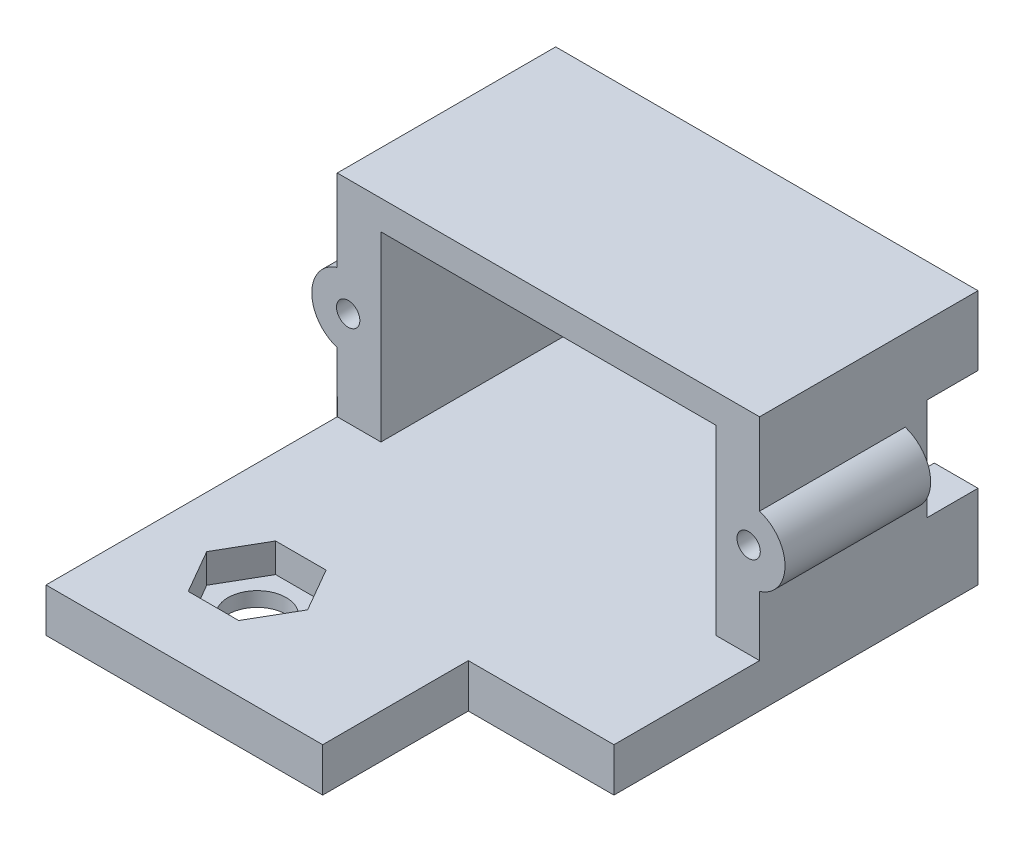
ISO-10303-21;
HEADER;
FILE_DESCRIPTION(('STEP AP214'),'2;1');
FILE_NAME('part.step','',(''),(''),'','','');
FILE_SCHEMA(('AUTOMOTIVE_DESIGN { 1 0 10303 214 1 1 1 1 }'));
ENDSEC;
DATA;
#1=APPLICATION_CONTEXT('core data for automotive mechanical design processes');
#2=APPLICATION_PROTOCOL_DEFINITION('international standard','automotive_design',2000,#1);
#3=PRODUCT_CONTEXT('',#1,'mechanical');
#4=PRODUCT('Part','Part','',(#3));
#5=PRODUCT_RELATED_PRODUCT_CATEGORY('part','',(#4));
#6=PRODUCT_DEFINITION_FORMATION('','',#4);
#7=PRODUCT_DEFINITION_CONTEXT('part definition',#1,'design');
#8=PRODUCT_DEFINITION('design','',#6,#7);
#9=PRODUCT_DEFINITION_SHAPE('','',#8);
#10=(LENGTH_UNIT() NAMED_UNIT(*) SI_UNIT(.MILLI.,.METRE.));
#11=(NAMED_UNIT(*) PLANE_ANGLE_UNIT() SI_UNIT($,.RADIAN.));
#12=(NAMED_UNIT(*) SI_UNIT($,.STERADIAN.) SOLID_ANGLE_UNIT());
#13=UNCERTAINTY_MEASURE_WITH_UNIT(LENGTH_MEASURE(1.E-05),#10,'distance_accuracy_value','');
#14=(GEOMETRIC_REPRESENTATION_CONTEXT(3) GLOBAL_UNCERTAINTY_ASSIGNED_CONTEXT((#13)) GLOBAL_UNIT_ASSIGNED_CONTEXT((#10,
#11,#12)) REPRESENTATION_CONTEXT('',''));
#15=CARTESIAN_POINT('',(0.,0.,0.));
#16=DIRECTION('',(0.,0.,1.));
#17=DIRECTION('',(1.,0.,0.));
#18=AXIS2_PLACEMENT_3D('',#15,#16,#17);
#19=CARTESIAN_POINT('',(0.,3.,0.));
#20=DIRECTION('',(0.,-1.,0.));
#21=DIRECTION('',(0.,0.,-1.));
#22=AXIS2_PLACEMENT_3D('',#19,#20,#21);
#23=PLANE('',#22);
#24=DIRECTION('',(1.,0.,0.));
#25=VECTOR('',#24,1.);
#26=CARTESIAN_POINT('',(-14.5,3.,27.5));
#27=LINE('',#26,#25);
#28=CARTESIAN_POINT('',(-14.5,3.,27.5));
#29=VERTEX_POINT('',#28);
#30=CARTESIAN_POINT('',(4.5,3.,27.5));
#31=VERTEX_POINT('',#30);
#32=EDGE_CURVE('E347',#29,#31,#27,.T.);
#33=ORIENTED_EDGE('',*,*,#32,.T.);
#34=DIRECTION('',(0.,0.,1.));
#35=VECTOR('',#34,1.);
#36=CARTESIAN_POINT('',(4.5,3.,17.5));
#37=LINE('',#36,#35);
#38=CARTESIAN_POINT('',(4.5,3.,17.5));
#39=VERTEX_POINT('',#38);
#40=EDGE_CURVE('E331',#39,#31,#37,.T.);
#41=ORIENTED_EDGE('',*,*,#40,.F.);
#42=DIRECTION('',(-1.,0.,0.));
#43=VECTOR('',#42,1.);
#44=CARTESIAN_POINT('',(14.5,3.,17.5));
#45=LINE('',#44,#43);
#46=CARTESIAN_POINT('',(14.5,3.,17.5));
#47=VERTEX_POINT('',#46);
#48=EDGE_CURVE('E317',#47,#39,#45,.T.);
#49=ORIENTED_EDGE('',*,*,#48,.F.);
#50=DIRECTION('',(0.,0.,-1.));
#51=VECTOR('',#50,1.);
#52=CARTESIAN_POINT('',(14.5,3.,7.5));
#53=LINE('',#52,#51);
#54=CARTESIAN_POINT('',(14.5,3.,7.5));
#55=VERTEX_POINT('',#54);
#56=EDGE_CURVE('E345',#47,#55,#53,.T.);
#57=ORIENTED_EDGE('',*,*,#56,.T.);
#58=DIRECTION('',(-1.,0.,0.));
#59=VECTOR('',#58,1.);
#60=CARTESIAN_POINT('',(-14.5,3.,7.5));
#61=LINE('',#60,#59);
#62=CARTESIAN_POINT('',(11.5,3.,7.5));
#63=VERTEX_POINT('',#62);
#64=EDGE_CURVE('E51',#55,#63,#61,.T.);
#65=ORIENTED_EDGE('',*,*,#64,.T.);
#66=DIRECTION('',(0.,0.,-1.));
#67=VECTOR('',#66,1.);
#68=CARTESIAN_POINT('',(11.5,3.,7.5));
#69=LINE('',#68,#67);
#70=CARTESIAN_POINT('',(11.5,3.,-7.5));
#71=VERTEX_POINT('',#70);
#72=EDGE_CURVE('E435',#63,#71,#69,.T.);
#73=ORIENTED_EDGE('',*,*,#72,.T.);
#74=DIRECTION('',(-1.,0.,0.));
#75=VECTOR('',#74,1.);
#76=CARTESIAN_POINT('',(-11.5,3.,-7.5));
#77=LINE('',#76,#75);
#78=CARTESIAN_POINT('',(-11.5,3.,-7.5));
#79=VERTEX_POINT('',#78);
#80=EDGE_CURVE('E438',#71,#79,#77,.T.);
#81=ORIENTED_EDGE('',*,*,#80,.T.);
#82=DIRECTION('',(0.,0.,1.));
#83=VECTOR('',#82,1.);
#84=CARTESIAN_POINT('',(-11.5,3.,7.5));
#85=LINE('',#84,#83);
#86=CARTESIAN_POINT('',(-11.5,3.,7.5));
#87=VERTEX_POINT('',#86);
#88=EDGE_CURVE('E441',#79,#87,#85,.T.);
#89=ORIENTED_EDGE('',*,*,#88,.T.);
#90=CARTESIAN_POINT('',(-14.5,3.,7.5));
#91=VERTEX_POINT('',#90);
#92=EDGE_CURVE('E11',#87,#91,#61,.T.);
#93=ORIENTED_EDGE('',*,*,#92,.T.);
#94=DIRECTION('',(0.,0.,1.));
#95=VECTOR('',#94,1.);
#96=CARTESIAN_POINT('',(-14.5,3.,7.5));
#97=LINE('',#96,#95);
#98=EDGE_CURVE('E351',#91,#29,#97,.T.);
#99=ORIENTED_EDGE('',*,*,#98,.T.);
#100=EDGE_LOOP('',(#33,#41,#49,#57,#65,#73,#81,#89,#93,#99));
#101=FACE_BOUND('',#100,.T.);
#102=DIRECTION('',(0.5,0.,0.866025403784439));
#103=VECTOR('',#102,1.);
#104=CARTESIAN_POINT('',(-11.6871778264911,3.,6.74759526419164));
#105=LINE('',#104,#103);
#106=CARTESIAN_POINT('',(-5.76794919243112,3.,17.));
#107=VERTEX_POINT('',#106);
#108=CARTESIAN_POINT('',(-4.03589838486224,3.,20.));
#109=VERTEX_POINT('',#108);
#110=EDGE_CURVE('E66',#107,#109,#105,.T.);
#111=ORIENTED_EDGE('',*,*,#110,.T.);
#112=DIRECTION('',(-0.5,0.,0.866025403784439));
#113=VECTOR('',#112,1.);
#114=CARTESIAN_POINT('',(5.63333024919771,3.,3.25240473580836));
#115=LINE('',#114,#113);
#116=CARTESIAN_POINT('',(-5.76794919243112,3.,23.));
#117=VERTEX_POINT('',#116);
#118=EDGE_CURVE('E289',#109,#117,#115,.T.);
#119=ORIENTED_EDGE('',*,*,#118,.T.);
#120=DIRECTION('',(-1.,0.,0.));
#121=VECTOR('',#120,1.);
#122=CARTESIAN_POINT('',(0.,3.,23.));
#123=LINE('',#122,#121);
#124=CARTESIAN_POINT('',(-9.23205080756888,3.,23.));
#125=VERTEX_POINT('',#124);
#126=EDGE_CURVE('E310',#117,#125,#123,.T.);
#127=ORIENTED_EDGE('',*,*,#126,.T.);
#128=DIRECTION('',(-0.5,0.,-0.866025403784439));
#129=VECTOR('',#128,1.);
#130=CARTESIAN_POINT('',(-16.8833302491977,3.,9.74759526419163));
#131=LINE('',#130,#129);
#132=CARTESIAN_POINT('',(-10.9641016151378,3.,20.));
#133=VERTEX_POINT('',#132);
#134=EDGE_CURVE('E307',#125,#133,#131,.T.);
#135=ORIENTED_EDGE('',*,*,#134,.T.);
#136=DIRECTION('',(0.5,0.,-0.866025403784439));
#137=VECTOR('',#136,1.);
#138=CARTESIAN_POINT('',(0.437177826491066,3.,0.252404735808352));
#139=LINE('',#138,#137);
#140=CARTESIAN_POINT('',(-9.23205080756887,3.,17.));
#141=VERTEX_POINT('',#140);
#142=EDGE_CURVE('E304',#133,#141,#139,.T.);
#143=ORIENTED_EDGE('',*,*,#142,.T.);
#144=DIRECTION('',(1.,0.,0.));
#145=VECTOR('',#144,1.);
#146=CARTESIAN_POINT('',(0.,3.,17.));
#147=LINE('',#146,#145);
#148=EDGE_CURVE('E301',#141,#107,#147,.T.);
#149=ORIENTED_EDGE('',*,*,#148,.T.);
#150=EDGE_LOOP('',(#111,#119,#127,#135,#143,#149));
#151=FACE_BOUND('',#150,.T.);
#152=ADVANCED_FACE('F35',(#101,#151),#23,.F.);
#153=CARTESIAN_POINT('',(-11.5,3.,7.5));
#154=DIRECTION('',(0.,0.,-1.));
#155=DIRECTION('',(-1.,0.,0.));
#156=AXIS2_PLACEMENT_3D('',#153,#154,#155);
#157=PLANE('',#156);
#158=CARTESIAN_POINT('',(-13.75,9.5,7.5));
#159=DIRECTION('',(0.,0.,1.));
#160=DIRECTION('',(1.,0.,0.));
#161=AXIS2_PLACEMENT_3D('',#158,#159,#160);
#162=CIRCLE('',#161,0.799999999999999);
#163=CARTESIAN_POINT('',(-12.95,9.5,7.5));
#164=VERTEX_POINT('',#163);
#165=EDGE_CURVE('E357',#164,#164,#162,.T.);
#166=ORIENTED_EDGE('',*,*,#165,.F.);
#167=EDGE_LOOP('',(#166));
#168=FACE_BOUND('',#167,.T.);
#169=ORIENTED_EDGE('',*,*,#92,.F.);
#170=DIRECTION('',(0.,1.,0.));
#171=VECTOR('',#170,1.);
#172=CARTESIAN_POINT('',(-11.5,0.,7.5));
#173=LINE('',#172,#171);
#174=CARTESIAN_POINT('',(-11.5,15.5,7.5));
#175=VERTEX_POINT('',#174);
#176=EDGE_CURVE('E412',#87,#175,#173,.T.);
#177=ORIENTED_EDGE('',*,*,#176,.T.);
#178=DIRECTION('',(1.,0.,0.));
#179=VECTOR('',#178,1.);
#180=CARTESIAN_POINT('',(-14.5,15.5,7.5));
#181=LINE('',#180,#179);
#182=CARTESIAN_POINT('',(11.5,15.5,7.5));
#183=VERTEX_POINT('',#182);
#184=EDGE_CURVE('E274',#175,#183,#181,.T.);
#185=ORIENTED_EDGE('',*,*,#184,.T.);
#186=DIRECTION('',(0.,1.,0.));
#187=VECTOR('',#186,1.);
#188=CARTESIAN_POINT('',(11.5,0.,7.5));
#189=LINE('',#188,#187);
#190=EDGE_CURVE('E422',#63,#183,#189,.T.);
#191=ORIENTED_EDGE('',*,*,#190,.F.);
#192=ORIENTED_EDGE('',*,*,#64,.F.);
#193=DIRECTION('',(0.,1.,0.));
#194=VECTOR('',#193,1.);
#195=CARTESIAN_POINT('',(14.5,0.,7.5));
#196=LINE('',#195,#194);
#197=CARTESIAN_POINT('',(14.5,7.11515199645764,7.5));
#198=VERTEX_POINT('',#197);
#199=EDGE_CURVE('E431',#55,#198,#196,.T.);
#200=ORIENTED_EDGE('',*,*,#199,.T.);
#201=CARTESIAN_POINT('',(13.75,9.5,7.5));
#202=DIRECTION('',(0.,0.,1.));
#203=DIRECTION('',(1.,0.,0.));
#204=AXIS2_PLACEMENT_3D('',#201,#202,#203);
#205=CIRCLE('',#204,2.5);
#206=CARTESIAN_POINT('',(14.5,11.8848480035424,7.5));
#207=VERTEX_POINT('',#206);
#208=EDGE_CURVE('E385',#198,#207,#205,.T.);
#209=ORIENTED_EDGE('',*,*,#208,.T.);
#210=CARTESIAN_POINT('',(14.5,17.5,7.5));
#211=VERTEX_POINT('',#210);
#212=EDGE_CURVE('E433',#207,#211,#196,.T.);
#213=ORIENTED_EDGE('',*,*,#212,.T.);
#214=DIRECTION('',(1.,0.,0.));
#215=VECTOR('',#214,1.);
#216=CARTESIAN_POINT('',(-14.5,17.5,7.5));
#217=LINE('',#216,#215);
#218=CARTESIAN_POINT('',(-14.5,17.5,7.5));
#219=VERTEX_POINT('',#218);
#220=EDGE_CURVE('E263',#219,#211,#217,.T.);
#221=ORIENTED_EDGE('',*,*,#220,.F.);
#222=DIRECTION('',(0.,1.,0.));
#223=VECTOR('',#222,1.);
#224=CARTESIAN_POINT('',(-14.5,0.,7.5));
#225=LINE('',#224,#223);
#226=CARTESIAN_POINT('',(-14.5,11.8848480035424,7.5));
#227=VERTEX_POINT('',#226);
#228=EDGE_CURVE('E416',#227,#219,#225,.T.);
#229=ORIENTED_EDGE('',*,*,#228,.F.);
#230=CARTESIAN_POINT('',(-13.75,9.5,7.5));
#231=DIRECTION('',(0.,0.,1.));
#232=DIRECTION('',(1.,0.,0.));
#233=AXIS2_PLACEMENT_3D('',#230,#231,#232);
#234=CIRCLE('',#233,2.5);
#235=CARTESIAN_POINT('',(-14.5,7.11515199645763,7.5));
#236=VERTEX_POINT('',#235);
#237=EDGE_CURVE('E370',#236,#227,#234,.F.);
#238=ORIENTED_EDGE('',*,*,#237,.F.);
#239=EDGE_CURVE('E414',#91,#236,#225,.T.);
#240=ORIENTED_EDGE('',*,*,#239,.F.);
#241=EDGE_LOOP('',(#169,#177,#185,#191,#192,#200,#209,#213,#221,#229,#238,#240));
#242=FACE_BOUND('',#241,.T.);
#243=CARTESIAN_POINT('',(13.75,9.5,7.5));
#244=DIRECTION('',(0.,0.,1.));
#245=DIRECTION('',(1.,0.,0.));
#246=AXIS2_PLACEMENT_3D('',#243,#244,#245);
#247=CIRCLE('',#246,0.799999999999999);
#248=CARTESIAN_POINT('',(14.55,9.5,7.5));
#249=VERTEX_POINT('',#248);
#250=EDGE_CURVE('E361',#249,#249,#247,.T.);
#251=ORIENTED_EDGE('',*,*,#250,.F.);
#252=EDGE_LOOP('',(#251));
#253=FACE_BOUND('',#252,.T.);
#254=ADVANCED_FACE('F469',(#168,#242,#253),#157,.F.);
#255=CARTESIAN_POINT('',(0.,0.,-2.5));
#256=DIRECTION('',(0.,0.,1.));
#257=DIRECTION('',(1.,0.,0.));
#258=AXIS2_PLACEMENT_3D('',#255,#256,#257);
#259=PLANE('',#258);
#260=CARTESIAN_POINT('',(-13.75,9.5,-2.5));
#261=DIRECTION('',(0.,0.,1.));
#262=DIRECTION('',(1.,0.,0.));
#263=AXIS2_PLACEMENT_3D('',#260,#261,#262);
#264=CIRCLE('',#263,0.799999999999998);
#265=CARTESIAN_POINT('',(-14.5,9.2216117818585,-2.5));
#266=VERTEX_POINT('',#265);
#267=CARTESIAN_POINT('',(-14.5,9.77838821814149,-2.5));
#268=VERTEX_POINT('',#267);
#269=EDGE_CURVE('E358',#266,#268,#264,.F.);
#270=ORIENTED_EDGE('',*,*,#269,.F.);
#271=DIRECTION('',(0.,-1.,0.));
#272=VECTOR('',#271,1.);
#273=CARTESIAN_POINT('',(-14.5,0.,-2.5));
#274=LINE('',#273,#272);
#275=CARTESIAN_POINT('',(-14.5,7.11515199645763,-2.5));
#276=VERTEX_POINT('',#275);
#277=EDGE_CURVE('E374',#266,#276,#274,.T.);
#278=ORIENTED_EDGE('',*,*,#277,.T.);
#279=CARTESIAN_POINT('',(-13.75,9.5,-2.5));
#280=DIRECTION('',(0.,0.,1.));
#281=DIRECTION('',(1.,0.,0.));
#282=AXIS2_PLACEMENT_3D('',#279,#280,#281);
#283=CIRCLE('',#282,2.5);
#284=CARTESIAN_POINT('',(-14.5,11.8848480035424,-2.5));
#285=VERTEX_POINT('',#284);
#286=EDGE_CURVE('E371',#276,#285,#283,.F.);
#287=ORIENTED_EDGE('',*,*,#286,.T.);
#288=EDGE_CURVE('E375',#285,#268,#274,.T.);
#289=ORIENTED_EDGE('',*,*,#288,.T.);
#290=EDGE_LOOP('',(#270,#278,#287,#289));
#291=FACE_BOUND('',#290,.T.);
#292=ADVANCED_FACE('F530',(#291),#259,.F.);
#293=CARTESIAN_POINT('',(-14.5,0.,-7.5));
#294=DIRECTION('',(-1.,0.,0.));
#295=DIRECTION('',(0.,0.,1.));
#296=AXIS2_PLACEMENT_3D('',#293,#294,#295);
#297=PLANE('',#296);
#298=DIRECTION('',(0.,0.,1.));
#299=VECTOR('',#298,1.);
#300=CARTESIAN_POINT('',(-14.5,0.,-7.5));
#301=LINE('',#300,#299);
#302=CARTESIAN_POINT('',(-14.5,0.,-7.5));
#303=VERTEX_POINT('',#302);
#304=CARTESIAN_POINT('',(-14.5,0.,27.5));
#305=VERTEX_POINT('',#304);
#306=EDGE_CURVE('E405',#303,#305,#301,.T.);
#307=ORIENTED_EDGE('',*,*,#306,.T.);
#308=DIRECTION('',(0.,-1.,0.));
#309=VECTOR('',#308,1.);
#310=CARTESIAN_POINT('',(-14.5,38.2278299076171,27.5));
#311=LINE('',#310,#309);
#312=EDGE_CURVE('E348',#29,#305,#311,.T.);
#313=ORIENTED_EDGE('',*,*,#312,.F.);
#314=ORIENTED_EDGE('',*,*,#98,.F.);
#315=ORIENTED_EDGE('',*,*,#239,.T.);
#316=DIRECTION('',(0.,0.,1.));
#317=VECTOR('',#316,1.);
#318=CARTESIAN_POINT('',(-14.5,7.11515199645763,-2.5));
#319=LINE('',#318,#317);
#320=EDGE_CURVE('E378',#276,#236,#319,.T.);
#321=ORIENTED_EDGE('',*,*,#320,.F.);
#322=ORIENTED_EDGE('',*,*,#277,.F.);
#323=EDGE_CURVE('E379',#268,#266,#274,.T.);
#324=ORIENTED_EDGE('',*,*,#323,.F.);
#325=ORIENTED_EDGE('',*,*,#288,.F.);
#326=DIRECTION('',(0.,0.,1.));
#327=VECTOR('',#326,1.);
#328=CARTESIAN_POINT('',(-14.5,11.8848480035424,-2.5));
#329=LINE('',#328,#327);
#330=EDGE_CURVE('E382',#285,#227,#329,.T.);
#331=ORIENTED_EDGE('',*,*,#330,.T.);
#332=ORIENTED_EDGE('',*,*,#228,.T.);
#333=DIRECTION('',(0.,0.,1.));
#334=VECTOR('',#333,1.);
#335=CARTESIAN_POINT('',(-14.5,17.5,-7.5));
#336=LINE('',#335,#334);
#337=CARTESIAN_POINT('',(-14.5,17.5,-7.5));
#338=VERTEX_POINT('',#337);
#339=EDGE_CURVE('E260',#338,#219,#336,.T.);
#340=ORIENTED_EDGE('',*,*,#339,.F.);
#341=DIRECTION('',(0.,1.,0.));
#342=VECTOR('',#341,1.);
#343=CARTESIAN_POINT('',(-14.5,0.,-7.5));
#344=LINE('',#343,#342);
#345=EDGE_CURVE('E408',#303,#338,#344,.T.);
#346=ORIENTED_EDGE('',*,*,#345,.F.);
#347=EDGE_LOOP('',(#307,#313,#314,#315,#321,#322,#324,#325,#331,#332,#340,#346));
#348=FACE_BOUND('',#347,.T.);
#349=ADVANCED_FACE('F454',(#348),#297,.T.);
#350=CARTESIAN_POINT('',(-11.5,3.,-7.5));
#351=DIRECTION('',(0.,0.,1.));
#352=DIRECTION('',(1.,0.,0.));
#353=AXIS2_PLACEMENT_3D('',#350,#351,#352);
#354=PLANE('',#353);
#355=DIRECTION('',(0.,1.,0.));
#356=VECTOR('',#355,1.);
#357=CARTESIAN_POINT('',(11.5,0.,-7.5));
#358=LINE('',#357,#356);
#359=CARTESIAN_POINT('',(11.5,5.75,-7.5));
#360=VERTEX_POINT('',#359);
#361=EDGE_CURVE('E423',#71,#360,#358,.T.);
#362=ORIENTED_EDGE('',*,*,#361,.T.);
#363=DIRECTION('',(-1.,0.,0.));
#364=VECTOR('',#363,1.);
#365=CARTESIAN_POINT('',(11.5,5.75,-7.5));
#366=LINE('',#365,#364);
#367=CARTESIAN_POINT('',(14.5,5.75,-7.5));
#368=VERTEX_POINT('',#367);
#369=EDGE_CURVE('E248',#368,#360,#366,.T.);
#370=ORIENTED_EDGE('',*,*,#369,.F.);
#371=DIRECTION('',(0.,1.,0.));
#372=VECTOR('',#371,1.);
#373=CARTESIAN_POINT('',(14.5,0.,-7.5));
#374=LINE('',#373,#372);
#375=CARTESIAN_POINT('',(14.5,0.,-7.5));
#376=VERTEX_POINT('',#375);
#377=EDGE_CURVE('E427',#376,#368,#374,.T.);
#378=ORIENTED_EDGE('',*,*,#377,.F.);
#379=DIRECTION('',(-1.,0.,0.));
#380=VECTOR('',#379,1.);
#381=CARTESIAN_POINT('',(-11.5,0.,-7.5));
#382=LINE('',#381,#380);
#383=EDGE_CURVE('E426',#376,#303,#382,.T.);
#384=ORIENTED_EDGE('',*,*,#383,.T.);
#385=ORIENTED_EDGE('',*,*,#345,.T.);
#386=DIRECTION('',(-1.,0.,0.));
#387=VECTOR('',#386,1.);
#388=CARTESIAN_POINT('',(-14.5,17.5,-7.5));
#389=LINE('',#388,#387);
#390=CARTESIAN_POINT('',(14.5,17.5,-7.5));
#391=VERTEX_POINT('',#390);
#392=EDGE_CURVE('E270',#391,#338,#389,.T.);
#393=ORIENTED_EDGE('',*,*,#392,.F.);
#394=CARTESIAN_POINT('',(14.5,12.75,-7.5));
#395=VERTEX_POINT('',#394);
#396=EDGE_CURVE('E430',#395,#391,#374,.T.);
#397=ORIENTED_EDGE('',*,*,#396,.F.);
#398=DIRECTION('',(1.,0.,0.));
#399=VECTOR('',#398,1.);
#400=CARTESIAN_POINT('',(11.5,12.75,-7.5));
#401=LINE('',#400,#399);
#402=CARTESIAN_POINT('',(11.5,12.75,-7.5));
#403=VERTEX_POINT('',#402);
#404=EDGE_CURVE('E502',#403,#395,#401,.T.);
#405=ORIENTED_EDGE('',*,*,#404,.F.);
#406=CARTESIAN_POINT('',(11.5,15.5,-7.5));
#407=VERTEX_POINT('',#406);
#408=EDGE_CURVE('E253',#403,#407,#358,.T.);
#409=ORIENTED_EDGE('',*,*,#408,.T.);
#410=DIRECTION('',(-1.,0.,0.));
#411=VECTOR('',#410,1.);
#412=CARTESIAN_POINT('',(-14.5,15.5,-7.5));
#413=LINE('',#412,#411);
#414=CARTESIAN_POINT('',(-11.5,15.5,-7.5));
#415=VERTEX_POINT('',#414);
#416=EDGE_CURVE('E264',#407,#415,#413,.T.);
#417=ORIENTED_EDGE('',*,*,#416,.T.);
#418=DIRECTION('',(0.,1.,0.));
#419=VECTOR('',#418,1.);
#420=CARTESIAN_POINT('',(-11.5,0.,-7.5));
#421=LINE('',#420,#419);
#422=EDGE_CURVE('E409',#79,#415,#421,.T.);
#423=ORIENTED_EDGE('',*,*,#422,.F.);
#424=ORIENTED_EDGE('',*,*,#80,.F.);
#425=EDGE_LOOP('',(#362,#370,#378,#384,#385,#393,#397,#405,#409,#417,#423,#424));
#426=FACE_BOUND('',#425,.T.);
#427=ADVANCED_FACE('F37',(#426),#354,.F.);
#428=CARTESIAN_POINT('',(0.,0.,0.));
#429=DIRECTION('',(0.,-1.,0.));
#430=DIRECTION('',(0.,0.,-1.));
#431=AXIS2_PLACEMENT_3D('',#428,#429,#430);
#432=PLANE('',#431);
#433=CARTESIAN_POINT('',(-7.5,0.,20.));
#434=DIRECTION('',(0.,-1.,0.));
#435=DIRECTION('',(0.,0.,-1.));
#436=AXIS2_PLACEMENT_3D('',#433,#434,#435);
#437=CIRCLE('',#436,2.);
#438=CARTESIAN_POINT('',(-7.5,0.,18.));
#439=VERTEX_POINT('',#438);
#440=EDGE_CURVE('E273',#439,#439,#437,.T.);
#441=ORIENTED_EDGE('',*,*,#440,.F.);
#442=EDGE_LOOP('',(#441));
#443=FACE_BOUND('',#442,.T.);
#444=DIRECTION('',(0.,0.,1.));
#445=VECTOR('',#444,1.);
#446=CARTESIAN_POINT('',(4.5,0.,17.5));
#447=LINE('',#446,#445);
#448=CARTESIAN_POINT('',(4.5,0.,17.5));
#449=VERTEX_POINT('',#448);
#450=CARTESIAN_POINT('',(4.5,0.,27.5));
#451=VERTEX_POINT('',#450);
#452=EDGE_CURVE('E330',#449,#451,#447,.T.);
#453=ORIENTED_EDGE('',*,*,#452,.T.);
#454=DIRECTION('',(-1.,0.,0.));
#455=VECTOR('',#454,1.);
#456=CARTESIAN_POINT('',(-14.5,0.,27.5));
#457=LINE('',#456,#455);
#458=EDGE_CURVE('E341',#451,#305,#457,.T.);
#459=ORIENTED_EDGE('',*,*,#458,.T.);
#460=ORIENTED_EDGE('',*,*,#306,.F.);
#461=ORIENTED_EDGE('',*,*,#383,.F.);
#462=DIRECTION('',(0.,0.,-1.));
#463=VECTOR('',#462,1.);
#464=CARTESIAN_POINT('',(14.5,0.,-7.5));
#465=LINE('',#464,#463);
#466=CARTESIAN_POINT('',(14.5,0.,17.5));
#467=VERTEX_POINT('',#466);
#468=EDGE_CURVE('E420',#467,#376,#465,.T.);
#469=ORIENTED_EDGE('',*,*,#468,.F.);
#470=DIRECTION('',(-1.,0.,0.));
#471=VECTOR('',#470,1.);
#472=CARTESIAN_POINT('',(14.5,0.,17.5));
#473=LINE('',#472,#471);
#474=EDGE_CURVE('E327',#467,#449,#473,.T.);
#475=ORIENTED_EDGE('',*,*,#474,.T.);
#476=EDGE_LOOP('',(#453,#459,#460,#461,#469,#475));
#477=FACE_BOUND('',#476,.T.);
#478=ADVANCED_FACE('F456',(#443,#477),#432,.T.);
#479=CARTESIAN_POINT('',(11.5,0.,-7.5));
#480=DIRECTION('',(-1.,0.,0.));
#481=DIRECTION('',(0.,0.,1.));
#482=AXIS2_PLACEMENT_3D('',#479,#480,#481);
#483=PLANE('',#482);
#484=DIRECTION('',(0.,0.,-1.));
#485=VECTOR('',#484,1.);
#486=CARTESIAN_POINT('',(11.5,5.75,-4.));
#487=LINE('',#486,#485);
#488=CARTESIAN_POINT('',(11.5,5.75,-4.));
#489=VERTEX_POINT('',#488);
#490=EDGE_CURVE('E277',#489,#360,#487,.T.);
#491=ORIENTED_EDGE('',*,*,#490,.T.);
#492=ORIENTED_EDGE('',*,*,#361,.F.);
#493=ORIENTED_EDGE('',*,*,#72,.F.);
#494=ORIENTED_EDGE('',*,*,#190,.T.);
#495=DIRECTION('',(0.,0.,1.));
#496=VECTOR('',#495,1.);
#497=CARTESIAN_POINT('',(11.5,15.5,-7.5));
#498=LINE('',#497,#496);
#499=EDGE_CURVE('E411',#407,#183,#498,.T.);
#500=ORIENTED_EDGE('',*,*,#499,.F.);
#501=ORIENTED_EDGE('',*,*,#408,.F.);
#502=DIRECTION('',(0.,0.,-1.));
#503=VECTOR('',#502,1.);
#504=CARTESIAN_POINT('',(11.5,12.75,-4.));
#505=LINE('',#504,#503);
#506=CARTESIAN_POINT('',(11.5,12.75,-4.));
#507=VERTEX_POINT('',#506);
#508=EDGE_CURVE('E233',#507,#403,#505,.T.);
#509=ORIENTED_EDGE('',*,*,#508,.F.);
#510=DIRECTION('',(0.,1.,0.));
#511=VECTOR('',#510,1.);
#512=CARTESIAN_POINT('',(11.5,5.75,-4.));
#513=LINE('',#512,#511);
#514=EDGE_CURVE('E239',#489,#507,#513,.T.);
#515=ORIENTED_EDGE('',*,*,#514,.F.);
#516=EDGE_LOOP('',(#491,#492,#493,#494,#500,#501,#509,#515));
#517=FACE_BOUND('',#516,.T.);
#518=ADVANCED_FACE('F251',(#517),#483,.T.);
#519=CARTESIAN_POINT('',(14.5,0.,-7.5));
#520=DIRECTION('',(1.,0.,0.));
#521=DIRECTION('',(0.,0.,-1.));
#522=AXIS2_PLACEMENT_3D('',#519,#520,#521);
#523=PLANE('',#522);
#524=DIRECTION('',(0.,0.,-1.));
#525=VECTOR('',#524,1.);
#526=CARTESIAN_POINT('',(14.5,5.75,-4.));
#527=LINE('',#526,#525);
#528=CARTESIAN_POINT('',(14.5,5.75,-4.));
#529=VERTEX_POINT('',#528);
#530=EDGE_CURVE('E255',#529,#368,#527,.T.);
#531=ORIENTED_EDGE('',*,*,#530,.F.);
#532=DIRECTION('',(0.,-1.,0.));
#533=VECTOR('',#532,1.);
#534=CARTESIAN_POINT('',(14.5,5.75,-4.));
#535=LINE('',#534,#533);
#536=CARTESIAN_POINT('',(14.5,12.75,-4.));
#537=VERTEX_POINT('',#536);
#538=EDGE_CURVE('E238',#537,#529,#535,.T.);
#539=ORIENTED_EDGE('',*,*,#538,.F.);
#540=DIRECTION('',(0.,0.,-1.));
#541=VECTOR('',#540,1.);
#542=CARTESIAN_POINT('',(14.5,12.75,-4.));
#543=LINE('',#542,#541);
#544=EDGE_CURVE('E236',#537,#395,#543,.T.);
#545=ORIENTED_EDGE('',*,*,#544,.T.);
#546=ORIENTED_EDGE('',*,*,#396,.T.);
#547=DIRECTION('',(0.,0.,-1.));
#548=VECTOR('',#547,1.);
#549=CARTESIAN_POINT('',(14.5,17.5,-7.5));
#550=LINE('',#549,#548);
#551=EDGE_CURVE('E267',#211,#391,#550,.T.);
#552=ORIENTED_EDGE('',*,*,#551,.F.);
#553=ORIENTED_EDGE('',*,*,#212,.F.);
#554=DIRECTION('',(0.,0.,1.));
#555=VECTOR('',#554,1.);
#556=CARTESIAN_POINT('',(14.5,11.8848480035424,-2.5));
#557=LINE('',#556,#555);
#558=CARTESIAN_POINT('',(14.5,11.8848480035424,-2.5));
#559=VERTEX_POINT('',#558);
#560=EDGE_CURVE('E397',#559,#207,#557,.T.);
#561=ORIENTED_EDGE('',*,*,#560,.F.);
#562=DIRECTION('',(0.,1.,0.));
#563=VECTOR('',#562,1.);
#564=CARTESIAN_POINT('',(14.5,0.,-2.5));
#565=LINE('',#564,#563);
#566=CARTESIAN_POINT('',(14.5,9.77838821814149,-2.5));
#567=VERTEX_POINT('',#566);
#568=EDGE_CURVE('E392',#567,#559,#565,.T.);
#569=ORIENTED_EDGE('',*,*,#568,.F.);
#570=CARTESIAN_POINT('',(14.5,5.67089975510545,-0.636214693863421));
#571=CARTESIAN_POINT('',(14.5,5.79348081733352,-0.708488285492515));
#572=CARTESIAN_POINT('',(14.5,5.91611212224876,-0.780676909885863));
#573=CARTESIAN_POINT('',(14.5,6.16170100784943,-0.924898395454181));
#574=CARTESIAN_POINT('',(14.5,6.2846588045033,-0.996930888764624));
#575=CARTESIAN_POINT('',(14.5,6.53464235197885,-1.14290467754795));
#576=CARTESIAN_POINT('',(14.5,6.66167459269657,-1.21683487938087));
#577=CARTESIAN_POINT('',(14.5,6.91587406110581,-1.36404139237766));
#578=CARTESIAN_POINT('',(14.5,7.04304083471516,-1.43731848856292));
#579=CARTESIAN_POINT('',(14.5,7.33769556049641,-1.60586698357486));
#580=CARTESIAN_POINT('',(14.5,7.50535140214305,-1.70084721760259));
#581=CARTESIAN_POINT('',(14.5,7.75839243191806,-1.84147585886768));
#582=CARTESIAN_POINT('',(14.5,7.84320387961307,-1.88815462938162));
#583=CARTESIAN_POINT('',(14.5,8.01339900551052,-1.98045446087285));
#584=CARTESIAN_POINT('',(14.5,8.09878266067308,-2.02607556411105));
#585=CARTESIAN_POINT('',(14.5,8.26845519560172,-2.11464064877644));
#586=CARTESIAN_POINT('',(14.5,8.35272449515104,-2.15762198581778));
#587=CARTESIAN_POINT('',(14.5,8.52269173956769,-2.24107189373064));
#588=CARTESIAN_POINT('',(14.5,8.60839178113023,-2.28153627321006));
#589=CARTESIAN_POINT('',(14.5,8.73812064569683,-2.33854892681364));
#590=CARTESIAN_POINT('',(14.5,8.78136079695137,-2.35686409653274));
#591=CARTESIAN_POINT('',(14.5,8.86848376011333,-2.39188748024012));
#592=CARTESIAN_POINT('',(14.5,8.91236675456919,-2.40859522715982));
#593=CARTESIAN_POINT('',(14.5,9.04496065361295,-2.45534756738765));
#594=CARTESIAN_POINT('',(14.5,9.13496089328855,-2.48218256653751));
#595=CARTESIAN_POINT('',(14.5,9.24462683170231,-2.50474327687327));
#596=CARTESIAN_POINT('',(14.5,9.26272522417947,-2.50814420038205));
#597=CARTESIAN_POINT('',(14.5,9.29904547530111,-2.51426528072215));
#598=CARTESIAN_POINT('',(14.5,9.31726738901883,-2.516985110135));
#599=CARTESIAN_POINT('',(14.5,9.37206106384209,-2.52403429683318));
#600=CARTESIAN_POINT('',(14.5,9.40878413532307,-2.52725830285902));
#601=CARTESIAN_POINT('',(14.5,9.48161111816031,-2.53042499332518));
#602=CARTESIAN_POINT('',(14.5,9.51771213486382,-2.53043413503571));
#603=CARTESIAN_POINT('',(14.5,9.58980102058958,-2.52733976167452));
#604=CARTESIAN_POINT('',(14.5,9.62578879284174,-2.52423407007388));
#605=CARTESIAN_POINT('',(14.5,9.71457565754987,-2.51299495801588));
#606=CARTESIAN_POINT('',(14.5,9.76715899995942,-2.50316451823209));
#607=CARTESIAN_POINT('',(14.5,9.8712046456306,-2.47869758874373));
#608=CARTESIAN_POINT('',(14.5,9.92266548884889,-2.46405519630639));
#609=CARTESIAN_POINT('',(14.5,10.0259378356694,-2.43092593695131));
#610=CARTESIAN_POINT('',(14.5,10.0777172019403,-2.41234101000166));
#611=CARTESIAN_POINT('',(14.5,10.1546537280238,-2.38263176445308));
#612=CARTESIAN_POINT('',(14.5,10.1801743358062,-2.37242461755686));
#613=CARTESIAN_POINT('',(14.5,10.2310084771652,-2.35149499972718));
#614=CARTESIAN_POINT('',(14.5,10.2563219785002,-2.34077245027881));
#615=CARTESIAN_POINT('',(14.5,10.3490087901253,-2.30059521471969));
#616=CARTESIAN_POINT('',(14.5,10.4158193710629,-2.26984472366258));
#617=CARTESIAN_POINT('',(14.5,10.5485426876782,-2.20645588885895));
#618=CARTESIAN_POINT('',(14.5,10.6144552103858,-2.17381710661928));
#619=CARTESIAN_POINT('',(14.5,10.7456801704733,-2.10727177343046));
#620=CARTESIAN_POINT('',(14.5,10.81099226194,-2.07336454254553));
#621=CARTESIAN_POINT('',(14.5,10.9411614090408,-2.00468580551699));
#622=CARTESIAN_POINT('',(14.5,11.0060184474552,-1.9699142668907));
#623=CARTESIAN_POINT('',(14.5,11.2003712739746,-1.86454242596499));
#624=CARTESIAN_POINT('',(14.5,11.329370952637,-1.79302885350373));
#625=CARTESIAN_POINT('',(14.5,11.5865728876984,-1.64869831706104));
#626=CARTESIAN_POINT('',(14.5,11.7147754123169,-1.57588182746755));
#627=CARTESIAN_POINT('',(14.5,11.9492321992202,-1.44171213686504));
#628=CARTESIAN_POINT('',(14.5,12.0555591856448,-1.38048593453906));
#629=CARTESIAN_POINT('',(14.5,12.267992790586,-1.25762632006091));
#630=CARTESIAN_POINT('',(14.5,12.3740993838467,-1.19599286429471));
#631=CARTESIAN_POINT('',(14.5,12.5857519860992,-1.07266524921302));
#632=CARTESIAN_POINT('',(14.5,12.6912986172345,-1.01097215692508));
#633=CARTESIAN_POINT('',(14.5,12.9022512060431,-0.887373986333995));
#634=CARTESIAN_POINT('',(14.5,13.0076571786674,-0.825468933554856));
#635=CARTESIAN_POINT('',(14.5,13.1130184361471,-0.763488205176762));
#636=B_SPLINE_CURVE_WITH_KNOTS('',3,(#570,#571,#572,#573,#574,#575,#576,#577,#578,#579,#580,
#581,#582,#583,#584,#585,#586,#587,#588,#589,#590,#591,#592,#593,#594,#595,#596,#597,#598,#599,
#600,#601,#602,#603,#604,#605,#606,#607,#608,#609,#610,#611,#612,#613,#614,#615,#616,#617,#618,
#619,#620,#621,#622,#623,#624,#625,#626,#627,#628,#629,#630,#631,#632,#633,#634,#635),
.UNSPECIFIED.,.F.,.F.,(4,2,2,2,2,2,2,2,2,2,2,2,2,2,2,2,2,2,2,2,2,2,2,2,2,2,2,2,2,2,2,2,4),(0.,
0.426903263889697,0.854414054414144,1.2953501339447,1.73565454070356,2.31370961366882,
2.60413086895966,2.89454049989924,3.17831270820724,3.46254547391226,3.60338658114304,
3.7442684897267,4.02489283110088,4.08012675750178,4.13538718543928,4.24583655389755,
4.35400258986161,4.46224426089801,4.62240285489641,4.78275865041071,4.94770515274208,
5.03015995978292,5.11262736780382,5.33321363066048,5.55385132460189,5.77460903266407,
5.9953750498946,6.43784560601316,6.88015821228531,7.2482420276452,7.61636592263641,
7.9831287123075,8.3498487897979),.UNSPECIFIED.);
#637=CARTESIAN_POINT('',(14.5,9.22161178185852,-2.5));
#638=VERTEX_POINT('',#637);
#639=EDGE_CURVE('E39',#638,#567,#636,.T.);
#640=ORIENTED_EDGE('',*,*,#639,.F.);
#641=CARTESIAN_POINT('',(14.5,7.11515199645764,-2.5));
#642=VERTEX_POINT('',#641);
#643=EDGE_CURVE('E388',#642,#638,#565,.T.);
#644=ORIENTED_EDGE('',*,*,#643,.F.);
#645=DIRECTION('',(0.,0.,1.));
#646=VECTOR('',#645,1.);
#647=CARTESIAN_POINT('',(14.5,7.11515199645764,-2.5));
#648=LINE('',#647,#646);
#649=EDGE_CURVE('E395',#642,#198,#648,.T.);
#650=ORIENTED_EDGE('',*,*,#649,.T.);
#651=ORIENTED_EDGE('',*,*,#199,.F.);
#652=ORIENTED_EDGE('',*,*,#56,.F.);
#653=DIRECTION('',(0.,1.,0.));
#654=VECTOR('',#653,1.);
#655=CARTESIAN_POINT('',(14.5,0.,17.5));
#656=LINE('',#655,#654);
#657=EDGE_CURVE('E334',#467,#47,#656,.T.);
#658=ORIENTED_EDGE('',*,*,#657,.F.);
#659=ORIENTED_EDGE('',*,*,#468,.T.);
#660=ORIENTED_EDGE('',*,*,#377,.T.);
#661=EDGE_LOOP('',(#531,#539,#545,#546,#552,#553,#561,#569,#640,#644,#650,#651,#652,#658,#659,#660));
#662=FACE_BOUND('',#661,.T.);
#663=ADVANCED_FACE('F488',(#662),#523,.T.);
#664=CARTESIAN_POINT('',(-11.5,0.,-7.5));
#665=DIRECTION('',(1.,0.,0.));
#666=DIRECTION('',(0.,0.,-1.));
#667=AXIS2_PLACEMENT_3D('',#664,#665,#666);
#668=PLANE('',#667);
#669=ORIENTED_EDGE('',*,*,#88,.F.);
#670=ORIENTED_EDGE('',*,*,#422,.T.);
#671=DIRECTION('',(0.,0.,-1.));
#672=VECTOR('',#671,1.);
#673=CARTESIAN_POINT('',(-11.5,15.5,-7.5));
#674=LINE('',#673,#672);
#675=EDGE_CURVE('E400',#175,#415,#674,.T.);
#676=ORIENTED_EDGE('',*,*,#675,.F.);
#677=ORIENTED_EDGE('',*,*,#176,.F.);
#678=EDGE_LOOP('',(#669,#670,#676,#677));
#679=FACE_BOUND('',#678,.T.);
#680=ADVANCED_FACE('F474',(#679),#668,.T.);
#681=CARTESIAN_POINT('',(13.75,9.5,-2.5));
#682=DIRECTION('',(0.,0.,1.));
#683=DIRECTION('',(1.,0.,0.));
#684=AXIS2_PLACEMENT_3D('',#681,#682,#683);
#685=CYLINDRICAL_SURFACE('',#684,2.5);
#686=ORIENTED_EDGE('',*,*,#208,.F.);
#687=ORIENTED_EDGE('',*,*,#649,.F.);
#688=CARTESIAN_POINT('',(13.75,9.5,-2.5));
#689=DIRECTION('',(0.,0.,1.));
#690=DIRECTION('',(1.,0.,0.));
#691=AXIS2_PLACEMENT_3D('',#688,#689,#690);
#692=CIRCLE('',#691,2.5);
#693=EDGE_CURVE('E391',#642,#559,#692,.T.);
#694=ORIENTED_EDGE('',*,*,#693,.T.);
#695=ORIENTED_EDGE('',*,*,#560,.T.);
#696=EDGE_LOOP('',(#686,#687,#694,#695));
#697=FACE_BOUND('',#696,.T.);
#698=ADVANCED_FACE('F492',(#697),#685,.T.);
#699=CARTESIAN_POINT('',(0.,0.,-2.5));
#700=DIRECTION('',(0.,0.,1.));
#701=DIRECTION('',(1.,0.,0.));
#702=AXIS2_PLACEMENT_3D('',#699,#700,#701);
#703=PLANE('',#702);
#704=ORIENTED_EDGE('',*,*,#643,.T.);
#705=CARTESIAN_POINT('',(13.75,9.5,-2.5));
#706=DIRECTION('',(0.,0.,1.));
#707=DIRECTION('',(1.,0.,0.));
#708=AXIS2_PLACEMENT_3D('',#705,#706,#707);
#709=CIRCLE('',#708,0.799999999999997);
#710=EDGE_CURVE('E367',#638,#567,#709,.T.);
#711=ORIENTED_EDGE('',*,*,#710,.T.);
#712=ORIENTED_EDGE('',*,*,#568,.T.);
#713=ORIENTED_EDGE('',*,*,#693,.F.);
#714=EDGE_LOOP('',(#704,#711,#712,#713));
#715=FACE_BOUND('',#714,.T.);
#716=ADVANCED_FACE('F783',(#715),#703,.F.);
#717=CARTESIAN_POINT('',(-13.75,9.5,-2.5));
#718=DIRECTION('',(0.,0.,1.));
#719=DIRECTION('',(1.,0.,0.));
#720=AXIS2_PLACEMENT_3D('',#717,#718,#719);
#721=CYLINDRICAL_SURFACE('',#720,2.5);
#722=ORIENTED_EDGE('',*,*,#237,.T.);
#723=ORIENTED_EDGE('',*,*,#330,.F.);
#724=ORIENTED_EDGE('',*,*,#286,.F.);
#725=ORIENTED_EDGE('',*,*,#320,.T.);
#726=EDGE_LOOP('',(#722,#723,#724,#725));
#727=FACE_BOUND('',#726,.T.);
#728=ADVANCED_FACE('F776',(#727),#721,.T.);
#729=CARTESIAN_POINT('',(13.75,9.5,-2.5));
#730=DIRECTION('',(0.,0.,1.));
#731=DIRECTION('',(1.,0.,0.));
#732=AXIS2_PLACEMENT_3D('',#729,#730,#731);
#733=CONICAL_SURFACE('',#732,0.799999999999997,1.02974425867665);
#734=ORIENTED_EDGE('',*,*,#639,.T.);
#735=EDGE_CURVE('E368',#567,#638,#709,.T.);
#736=ORIENTED_EDGE('',*,*,#735,.T.);
#737=EDGE_LOOP('',(#734,#736));
#738=FACE_BOUND('',#737,.T.);
#739=CARTESIAN_POINT('',(13.75,9.5,-2.98068849522205));
#740=VERTEX_POINT('',#739);
#741=VERTEX_LOOP('',#740);
#742=FACE_BOUND('',#741,.T.);
#743=ADVANCED_FACE('F766',(#738,#742),#733,.F.);
#744=CARTESIAN_POINT('',(13.75,9.5,7.5));
#745=DIRECTION('',(0.,0.,1.));
#746=DIRECTION('',(1.,0.,0.));
#747=AXIS2_PLACEMENT_3D('',#744,#745,#746);
#748=CYLINDRICAL_SURFACE('',#747,0.799999999999998);
#749=ORIENTED_EDGE('',*,*,#735,.F.);
#750=ORIENTED_EDGE('',*,*,#710,.F.);
#751=EDGE_LOOP('',(#749,#750));
#752=FACE_BOUND('',#751,.T.);
#753=ORIENTED_EDGE('',*,*,#250,.T.);
#754=EDGE_LOOP('',(#753));
#755=FACE_BOUND('',#754,.T.);
#756=ADVANCED_FACE('F756',(#752,#755),#748,.F.);
#757=CARTESIAN_POINT('',(0.,0.,-2.5));
#758=DIRECTION('',(0.,0.,1.));
#759=DIRECTION('',(1.,0.,0.));
#760=AXIS2_PLACEMENT_3D('',#757,#758,#759);
#761=PLANE('',#760);
#762=ORIENTED_EDGE('',*,*,#323,.T.);
#763=EDGE_CURVE('E362',#268,#266,#264,.F.);
#764=ORIENTED_EDGE('',*,*,#763,.F.);
#765=EDGE_LOOP('',(#762,#764));
#766=FACE_BOUND('',#765,.T.);
#767=ADVANCED_FACE('F745',(#766),#761,.T.);
#768=CARTESIAN_POINT('',(-13.75,9.5,7.5));
#769=DIRECTION('',(0.,0.,1.));
#770=DIRECTION('',(1.,0.,0.));
#771=AXIS2_PLACEMENT_3D('',#768,#769,#770);
#772=CYLINDRICAL_SURFACE('',#771,0.799999999999998);
#773=ORIENTED_EDGE('',*,*,#269,.T.);
#774=ORIENTED_EDGE('',*,*,#763,.T.);
#775=EDGE_LOOP('',(#773,#774));
#776=FACE_BOUND('',#775,.T.);
#777=ORIENTED_EDGE('',*,*,#165,.T.);
#778=EDGE_LOOP('',(#777));
#779=FACE_BOUND('',#778,.T.);
#780=ADVANCED_FACE('F522',(#776,#779),#772,.F.);
#781=CARTESIAN_POINT('',(-14.5,38.2278299076171,27.5));
#782=DIRECTION('',(0.,0.,1.));
#783=DIRECTION('',(1.,0.,0.));
#784=AXIS2_PLACEMENT_3D('',#781,#782,#783);
#785=PLANE('',#784);
#786=DIRECTION('',(0.,1.,0.));
#787=VECTOR('',#786,1.);
#788=CARTESIAN_POINT('',(4.5,0.,27.5));
#789=LINE('',#788,#787);
#790=EDGE_CURVE('E338',#451,#31,#789,.T.);
#791=ORIENTED_EDGE('',*,*,#790,.T.);
#792=ORIENTED_EDGE('',*,*,#32,.F.);
#793=ORIENTED_EDGE('',*,*,#312,.T.);
#794=ORIENTED_EDGE('',*,*,#458,.F.);
#795=EDGE_LOOP('',(#791,#792,#793,#794));
#796=FACE_BOUND('',#795,.T.);
#797=ADVANCED_FACE('F460',(#796),#785,.T.);
#798=CARTESIAN_POINT('',(4.5,0.,17.5));
#799=DIRECTION('',(-1.,0.,0.));
#800=DIRECTION('',(0.,0.,1.));
#801=AXIS2_PLACEMENT_3D('',#798,#799,#800);
#802=PLANE('',#801);
#803=ORIENTED_EDGE('',*,*,#40,.T.);
#804=ORIENTED_EDGE('',*,*,#790,.F.);
#805=ORIENTED_EDGE('',*,*,#452,.F.);
#806=DIRECTION('',(0.,1.,0.));
#807=VECTOR('',#806,1.);
#808=CARTESIAN_POINT('',(4.5,0.,17.5));
#809=LINE('',#808,#807);
#810=EDGE_CURVE('E342',#449,#39,#809,.T.);
#811=ORIENTED_EDGE('',*,*,#810,.T.);
#812=EDGE_LOOP('',(#803,#804,#805,#811));
#813=FACE_BOUND('',#812,.T.);
#814=ADVANCED_FACE('F513',(#813),#802,.F.);
#815=CARTESIAN_POINT('',(14.5,0.,17.5));
#816=DIRECTION('',(0.,0.,-1.));
#817=DIRECTION('',(-1.,0.,0.));
#818=AXIS2_PLACEMENT_3D('',#815,#816,#817);
#819=PLANE('',#818);
#820=ORIENTED_EDGE('',*,*,#48,.T.);
#821=ORIENTED_EDGE('',*,*,#810,.F.);
#822=ORIENTED_EDGE('',*,*,#474,.F.);
#823=ORIENTED_EDGE('',*,*,#657,.T.);
#824=EDGE_LOOP('',(#820,#821,#822,#823));
#825=FACE_BOUND('',#824,.T.);
#826=ADVANCED_FACE('F511',(#825),#819,.F.);
#827=CARTESIAN_POINT('',(-11.6871778264911,1.,6.74759526419164));
#828=DIRECTION('',(-0.866025403784439,0.,0.5));
#829=DIRECTION('',(0.5,0.,0.866025403784439));
#830=AXIS2_PLACEMENT_3D('',#827,#828,#829);
#831=PLANE('',#830);
#832=ORIENTED_EDGE('',*,*,#110,.F.);
#833=DIRECTION('',(0.,1.,0.));
#834=VECTOR('',#833,1.);
#835=CARTESIAN_POINT('',(-5.76794919243112,1.,17.));
#836=LINE('',#835,#834);
#837=CARTESIAN_POINT('',(-5.76794919243112,1.,17.));
#838=VERTEX_POINT('',#837);
#839=EDGE_CURVE('E299',#838,#107,#836,.T.);
#840=ORIENTED_EDGE('',*,*,#839,.F.);
#841=DIRECTION('',(0.5,0.,0.866025403784439));
#842=VECTOR('',#841,1.);
#843=CARTESIAN_POINT('',(-11.6871778264911,1.,6.74759526419164));
#844=LINE('',#843,#842);
#845=CARTESIAN_POINT('',(-4.03589838486224,1.,20.));
#846=VERTEX_POINT('',#845);
#847=EDGE_CURVE('E285',#838,#846,#844,.T.);
#848=ORIENTED_EDGE('',*,*,#847,.T.);
#849=DIRECTION('',(0.,1.,0.));
#850=VECTOR('',#849,1.);
#851=CARTESIAN_POINT('',(-4.03589838486224,1.,20.));
#852=LINE('',#851,#850);
#853=EDGE_CURVE('E315',#846,#109,#852,.T.);
#854=ORIENTED_EDGE('',*,*,#853,.T.);
#855=EDGE_LOOP('',(#832,#840,#848,#854));
#856=FACE_BOUND('',#855,.T.);
#857=ADVANCED_FACE('F520',(#856),#831,.T.);
#858=CARTESIAN_POINT('',(5.63333024919771,1.,3.25240473580836));
#859=DIRECTION('',(-0.866025403784439,0.,-0.5));
#860=DIRECTION('',(-0.5,0.,0.866025403784439));
#861=AXIS2_PLACEMENT_3D('',#858,#859,#860);
#862=PLANE('',#861);
#863=ORIENTED_EDGE('',*,*,#118,.F.);
#864=ORIENTED_EDGE('',*,*,#853,.F.);
#865=DIRECTION('',(-0.5,0.,0.866025403784439));
#866=VECTOR('',#865,1.);
#867=CARTESIAN_POINT('',(5.63333024919771,1.,3.25240473580836));
#868=LINE('',#867,#866);
#869=CARTESIAN_POINT('',(-5.76794919243112,1.,23.));
#870=VERTEX_POINT('',#869);
#871=EDGE_CURVE('E297',#846,#870,#868,.T.);
#872=ORIENTED_EDGE('',*,*,#871,.T.);
#873=DIRECTION('',(0.,1.,0.));
#874=VECTOR('',#873,1.);
#875=CARTESIAN_POINT('',(-5.76794919243112,1.,23.));
#876=LINE('',#875,#874);
#877=EDGE_CURVE('E318',#870,#117,#876,.T.);
#878=ORIENTED_EDGE('',*,*,#877,.T.);
#879=EDGE_LOOP('',(#863,#864,#872,#878));
#880=FACE_BOUND('',#879,.T.);
#881=ADVANCED_FACE('F557',(#880),#862,.T.);
#882=CARTESIAN_POINT('',(0.,1.,23.));
#883=DIRECTION('',(0.,0.,-1.));
#884=DIRECTION('',(-1.,0.,0.));
#885=AXIS2_PLACEMENT_3D('',#882,#883,#884);
#886=PLANE('',#885);
#887=ORIENTED_EDGE('',*,*,#126,.F.);
#888=ORIENTED_EDGE('',*,*,#877,.F.);
#889=DIRECTION('',(-1.,0.,0.));
#890=VECTOR('',#889,1.);
#891=CARTESIAN_POINT('',(0.,1.,23.));
#892=LINE('',#891,#890);
#893=CARTESIAN_POINT('',(-9.23205080756888,1.,23.));
#894=VERTEX_POINT('',#893);
#895=EDGE_CURVE('E295',#870,#894,#892,.T.);
#896=ORIENTED_EDGE('',*,*,#895,.T.);
#897=DIRECTION('',(0.,1.,0.));
#898=VECTOR('',#897,1.);
#899=CARTESIAN_POINT('',(-9.23205080756888,1.,23.));
#900=LINE('',#899,#898);
#901=EDGE_CURVE('E320',#894,#125,#900,.T.);
#902=ORIENTED_EDGE('',*,*,#901,.T.);
#903=EDGE_LOOP('',(#887,#888,#896,#902));
#904=FACE_BOUND('',#903,.T.);
#905=ADVANCED_FACE('F560',(#904),#886,.T.);
#906=CARTESIAN_POINT('',(-16.8833302491977,1.,9.74759526419163));
#907=DIRECTION('',(0.866025403784439,0.,-0.5));
#908=DIRECTION('',(-0.5,0.,-0.866025403784439));
#909=AXIS2_PLACEMENT_3D('',#906,#907,#908);
#910=PLANE('',#909);
#911=ORIENTED_EDGE('',*,*,#134,.F.);
#912=ORIENTED_EDGE('',*,*,#901,.F.);
#913=DIRECTION('',(-0.5,0.,-0.866025403784439));
#914=VECTOR('',#913,1.);
#915=CARTESIAN_POINT('',(-16.8833302491977,1.,9.74759526419163));
#916=LINE('',#915,#914);
#917=CARTESIAN_POINT('',(-10.9641016151378,1.,20.));
#918=VERTEX_POINT('',#917);
#919=EDGE_CURVE('E293',#894,#918,#916,.T.);
#920=ORIENTED_EDGE('',*,*,#919,.T.);
#921=DIRECTION('',(0.,1.,0.));
#922=VECTOR('',#921,1.);
#923=CARTESIAN_POINT('',(-10.9641016151378,1.,20.));
#924=LINE('',#923,#922);
#925=EDGE_CURVE('E322',#918,#133,#924,.T.);
#926=ORIENTED_EDGE('',*,*,#925,.T.);
#927=EDGE_LOOP('',(#911,#912,#920,#926));
#928=FACE_BOUND('',#927,.T.);
#929=ADVANCED_FACE('F564',(#928),#910,.T.);
#930=CARTESIAN_POINT('',(0.437177826491066,1.,0.252404735808352));
#931=DIRECTION('',(0.866025403784439,0.,0.5));
#932=DIRECTION('',(0.5,0.,-0.866025403784439));
#933=AXIS2_PLACEMENT_3D('',#930,#931,#932);
#934=PLANE('',#933);
#935=ORIENTED_EDGE('',*,*,#142,.F.);
#936=ORIENTED_EDGE('',*,*,#925,.F.);
#937=DIRECTION('',(0.5,0.,-0.866025403784439));
#938=VECTOR('',#937,1.);
#939=CARTESIAN_POINT('',(0.437177826491066,1.,0.252404735808352));
#940=LINE('',#939,#938);
#941=CARTESIAN_POINT('',(-9.23205080756887,1.,17.));
#942=VERTEX_POINT('',#941);
#943=EDGE_CURVE('E291',#918,#942,#940,.T.);
#944=ORIENTED_EDGE('',*,*,#943,.T.);
#945=DIRECTION('',(0.,1.,0.));
#946=VECTOR('',#945,1.);
#947=CARTESIAN_POINT('',(-9.23205080756887,1.,17.));
#948=LINE('',#947,#946);
#949=EDGE_CURVE('E324',#942,#141,#948,.T.);
#950=ORIENTED_EDGE('',*,*,#949,.T.);
#951=EDGE_LOOP('',(#935,#936,#944,#950));
#952=FACE_BOUND('',#951,.T.);
#953=ADVANCED_FACE('F568',(#952),#934,.T.);
#954=CARTESIAN_POINT('',(0.,1.,17.));
#955=DIRECTION('',(0.,0.,1.));
#956=DIRECTION('',(1.,0.,0.));
#957=AXIS2_PLACEMENT_3D('',#954,#955,#956);
#958=PLANE('',#957);
#959=ORIENTED_EDGE('',*,*,#148,.F.);
#960=ORIENTED_EDGE('',*,*,#949,.F.);
#961=DIRECTION('',(1.,0.,0.));
#962=VECTOR('',#961,1.);
#963=CARTESIAN_POINT('',(0.,1.,17.));
#964=LINE('',#963,#962);
#965=EDGE_CURVE('E288',#942,#838,#964,.T.);
#966=ORIENTED_EDGE('',*,*,#965,.T.);
#967=ORIENTED_EDGE('',*,*,#839,.T.);
#968=EDGE_LOOP('',(#959,#960,#966,#967));
#969=FACE_BOUND('',#968,.T.);
#970=ADVANCED_FACE('F552',(#969),#958,.T.);
#971=CARTESIAN_POINT('',(0.,1.,0.));
#972=DIRECTION('',(0.,1.,0.));
#973=DIRECTION('',(0.,0.,1.));
#974=AXIS2_PLACEMENT_3D('',#971,#972,#973);
#975=PLANE('',#974);
#976=CARTESIAN_POINT('',(-7.5,1.,20.));
#977=DIRECTION('',(0.,1.,0.));
#978=DIRECTION('',(0.,0.,1.));
#979=AXIS2_PLACEMENT_3D('',#976,#977,#978);
#980=CIRCLE('',#979,2.);
#981=CARTESIAN_POINT('',(-7.5,1.,22.));
#982=VERTEX_POINT('',#981);
#983=EDGE_CURVE('E282',#982,#982,#980,.T.);
#984=ORIENTED_EDGE('',*,*,#983,.F.);
#985=EDGE_LOOP('',(#984));
#986=FACE_BOUND('',#985,.T.);
#987=ORIENTED_EDGE('',*,*,#847,.F.);
#988=ORIENTED_EDGE('',*,*,#965,.F.);
#989=ORIENTED_EDGE('',*,*,#943,.F.);
#990=ORIENTED_EDGE('',*,*,#919,.F.);
#991=ORIENTED_EDGE('',*,*,#895,.F.);
#992=ORIENTED_EDGE('',*,*,#871,.F.);
#993=EDGE_LOOP('',(#987,#988,#989,#990,#991,#992));
#994=FACE_BOUND('',#993,.T.);
#995=ADVANCED_FACE('F544',(#986,#994),#975,.T.);
#996=CARTESIAN_POINT('',(-7.5,0.,20.));
#997=DIRECTION('',(0.,-1.,0.));
#998=DIRECTION('',(0.,0.,-1.));
#999=AXIS2_PLACEMENT_3D('',#996,#997,#998);
#1000=CYLINDRICAL_SURFACE('',#999,2.);
#1001=ORIENTED_EDGE('',*,*,#983,.T.);
#1002=EDGE_LOOP('',(#1001));
#1003=FACE_BOUND('',#1002,.T.);
#1004=ORIENTED_EDGE('',*,*,#440,.T.);
#1005=EDGE_LOOP('',(#1004));
#1006=FACE_BOUND('',#1005,.T.);
#1007=ADVANCED_FACE('F542',(#1003,#1006),#1000,.F.);
#1008=CARTESIAN_POINT('',(0.,17.5,0.));
#1009=DIRECTION('',(0.,1.,0.));
#1010=DIRECTION('',(0.,0.,1.));
#1011=AXIS2_PLACEMENT_3D('',#1008,#1009,#1010);
#1012=PLANE('',#1011);
#1013=ORIENTED_EDGE('',*,*,#339,.T.);
#1014=ORIENTED_EDGE('',*,*,#220,.T.);
#1015=ORIENTED_EDGE('',*,*,#551,.T.);
#1016=ORIENTED_EDGE('',*,*,#392,.T.);
#1017=EDGE_LOOP('',(#1013,#1014,#1015,#1016));
#1018=FACE_BOUND('',#1017,.T.);
#1019=ADVANCED_FACE('F500',(#1018),#1012,.T.);
#1020=CARTESIAN_POINT('',(0.,15.5,0.));
#1021=DIRECTION('',(0.,1.,0.));
#1022=DIRECTION('',(0.,0.,1.));
#1023=AXIS2_PLACEMENT_3D('',#1020,#1021,#1022);
#1024=PLANE('',#1023);
#1025=ORIENTED_EDGE('',*,*,#499,.T.);
#1026=ORIENTED_EDGE('',*,*,#184,.F.);
#1027=ORIENTED_EDGE('',*,*,#675,.T.);
#1028=ORIENTED_EDGE('',*,*,#416,.F.);
#1029=EDGE_LOOP('',(#1025,#1026,#1027,#1028));
#1030=FACE_BOUND('',#1029,.T.);
#1031=ADVANCED_FACE('F479',(#1030),#1024,.F.);
#1032=CARTESIAN_POINT('',(11.5,5.75,-4.));
#1033=DIRECTION('',(0.,-1.,0.));
#1034=DIRECTION('',(0.,0.,-1.));
#1035=AXIS2_PLACEMENT_3D('',#1032,#1033,#1034);
#1036=PLANE('',#1035);
#1037=ORIENTED_EDGE('',*,*,#369,.T.);
#1038=ORIENTED_EDGE('',*,*,#490,.F.);
#1039=DIRECTION('',(-1.,0.,0.));
#1040=VECTOR('',#1039,1.);
#1041=CARTESIAN_POINT('',(11.5,5.75,-4.));
#1042=LINE('',#1041,#1040);
#1043=EDGE_CURVE('E245',#529,#489,#1042,.T.);
#1044=ORIENTED_EDGE('',*,*,#1043,.F.);
#1045=ORIENTED_EDGE('',*,*,#530,.T.);
#1046=EDGE_LOOP('',(#1037,#1038,#1044,#1045));
#1047=FACE_BOUND('',#1046,.T.);
#1048=ADVANCED_FACE('F508',(#1047),#1036,.F.);
#1049=CARTESIAN_POINT('',(11.5,12.75,-4.));
#1050=DIRECTION('',(0.,1.,0.));
#1051=DIRECTION('',(-1.,0.,0.));
#1052=AXIS2_PLACEMENT_3D('',#1049,#1050,#1051);
#1053=PLANE('',#1052);
#1054=ORIENTED_EDGE('',*,*,#404,.T.);
#1055=ORIENTED_EDGE('',*,*,#544,.F.);
#1056=DIRECTION('',(1.,0.,0.));
#1057=VECTOR('',#1056,1.);
#1058=CARTESIAN_POINT('',(11.5,12.75,-4.));
#1059=LINE('',#1058,#1057);
#1060=EDGE_CURVE('E58',#507,#537,#1059,.T.);
#1061=ORIENTED_EDGE('',*,*,#1060,.F.);
#1062=ORIENTED_EDGE('',*,*,#508,.T.);
#1063=EDGE_LOOP('',(#1054,#1055,#1061,#1062));
#1064=FACE_BOUND('',#1063,.T.);
#1065=ADVANCED_FACE('F231',(#1064),#1053,.F.);
#1066=CARTESIAN_POINT('',(0.,0.,-4.));
#1067=DIRECTION('',(0.,0.,-1.));
#1068=DIRECTION('',(-1.,0.,0.));
#1069=AXIS2_PLACEMENT_3D('',#1066,#1067,#1068);
#1070=PLANE('',#1069);
#1071=ORIENTED_EDGE('',*,*,#514,.T.);
#1072=ORIENTED_EDGE('',*,*,#1060,.T.);
#1073=ORIENTED_EDGE('',*,*,#538,.T.);
#1074=ORIENTED_EDGE('',*,*,#1043,.T.);
#1075=EDGE_LOOP('',(#1071,#1072,#1073,#1074));
#1076=FACE_BOUND('',#1075,.T.);
#1077=ADVANCED_FACE('F243',(#1076),#1070,.T.);
#1078=CLOSED_SHELL('',(#152,#254,#292,#349,#427,#478,#518,#663,#680,#698,#716,#728,#743,#756,
#767,#780,#797,#814,#826,#857,#881,#905,#929,#953,#970,#995,#1007,#1019,#1031,#1048,#1065,#1077));
#1079=MANIFOLD_SOLID_BREP('B2',#1078);
#1080=ADVANCED_BREP_SHAPE_REPRESENTATION('',(#18,#1079),#14);
#1081=SHAPE_DEFINITION_REPRESENTATION(#9,#1080);
ENDSEC;
END-ISO-10303-21;
